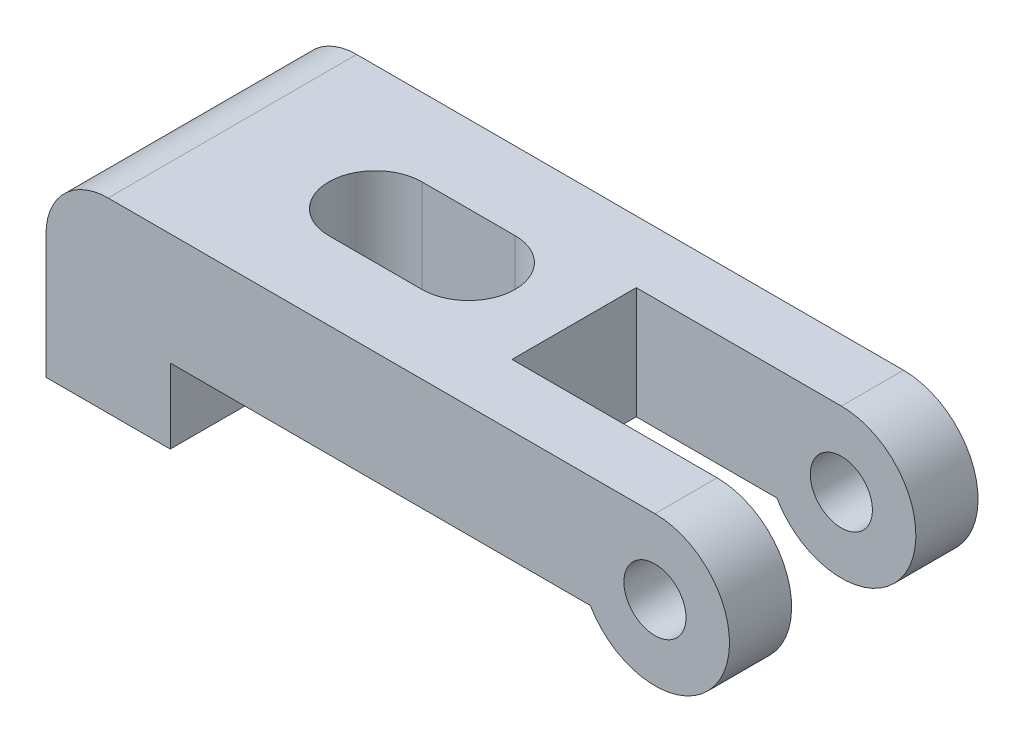
ISO-10303-21;
HEADER;
FILE_DESCRIPTION(('STEP AP214'),'2;1');
FILE_NAME('part.step','',(''),(''),'','','');
FILE_SCHEMA(('AUTOMOTIVE_DESIGN { 1 0 10303 214 1 1 1 1 }'));
ENDSEC;
DATA;
#1=APPLICATION_CONTEXT('core data for automotive mechanical design processes');
#2=APPLICATION_PROTOCOL_DEFINITION('international standard','automotive_design',2000,#1);
#3=PRODUCT_CONTEXT('',#1,'mechanical');
#4=PRODUCT('Part','Part','',(#3));
#5=PRODUCT_RELATED_PRODUCT_CATEGORY('part','',(#4));
#6=PRODUCT_DEFINITION_FORMATION('','',#4);
#7=PRODUCT_DEFINITION_CONTEXT('part definition',#1,'design');
#8=PRODUCT_DEFINITION('design','',#6,#7);
#9=PRODUCT_DEFINITION_SHAPE('','',#8);
#10=(LENGTH_UNIT() NAMED_UNIT(*) SI_UNIT(.MILLI.,.METRE.));
#11=(NAMED_UNIT(*) PLANE_ANGLE_UNIT() SI_UNIT($,.RADIAN.));
#12=(NAMED_UNIT(*) SI_UNIT($,.STERADIAN.) SOLID_ANGLE_UNIT());
#13=UNCERTAINTY_MEASURE_WITH_UNIT(LENGTH_MEASURE(1.E-05),#10,'distance_accuracy_value','');
#14=(GEOMETRIC_REPRESENTATION_CONTEXT(3) GLOBAL_UNCERTAINTY_ASSIGNED_CONTEXT((#13)) GLOBAL_UNIT_ASSIGNED_CONTEXT((#10,
#11,#12)) REPRESENTATION_CONTEXT('',''));
#15=CARTESIAN_POINT('',(0.,0.,0.));
#16=DIRECTION('',(0.,0.,1.));
#17=DIRECTION('',(1.,0.,0.));
#18=AXIS2_PLACEMENT_3D('',#15,#16,#17);
#19=CARTESIAN_POINT('',(980.,180.,400.));
#20=DIRECTION('',(0.,0.,-1.));
#21=DIRECTION('',(-1.,0.,0.));
#22=AXIS2_PLACEMENT_3D('',#19,#20,#21);
#23=CYLINDRICAL_SURFACE('',#22,120.);
#24=DIRECTION('',(0.,0.,-1.));
#25=VECTOR('',#24,1.);
#26=CARTESIAN_POINT('',(980.,300.,400.));
#27=LINE('',#26,#25);
#28=CARTESIAN_POINT('',(980.,300.,100.));
#29=VERTEX_POINT('',#28);
#30=CARTESIAN_POINT('',(980.,300.,0.));
#31=VERTEX_POINT('',#30);
#32=EDGE_CURVE('E301',#29,#31,#27,.T.);
#33=ORIENTED_EDGE('',*,*,#32,.F.);
#34=CARTESIAN_POINT('',(980.,180.,100.));
#35=DIRECTION('',(0.,0.,-1.));
#36=DIRECTION('',(-1.,0.,0.));
#37=AXIS2_PLACEMENT_3D('',#34,#35,#36);
#38=CIRCLE('',#37,120.);
#39=CARTESIAN_POINT('',(876.076951545867,120.,100.));
#40=VERTEX_POINT('',#39);
#41=EDGE_CURVE('E210',#29,#40,#38,.T.);
#42=ORIENTED_EDGE('',*,*,#41,.T.);
#43=DIRECTION('',(0.,0.,-1.));
#44=VECTOR('',#43,1.);
#45=CARTESIAN_POINT('',(876.076951545867,120.,400.));
#46=LINE('',#45,#44);
#47=CARTESIAN_POINT('',(876.076951545867,120.,0.));
#48=VERTEX_POINT('',#47);
#49=EDGE_CURVE('E306',#40,#48,#46,.T.);
#50=ORIENTED_EDGE('',*,*,#49,.T.);
#51=CARTESIAN_POINT('',(980.,180.,0.));
#52=DIRECTION('',(0.,0.,1.));
#53=DIRECTION('',(1.,0.,0.));
#54=AXIS2_PLACEMENT_3D('',#51,#52,#53);
#55=CIRCLE('',#54,120.);
#56=EDGE_CURVE('E278',#48,#31,#55,.T.);
#57=ORIENTED_EDGE('',*,*,#56,.T.);
#58=EDGE_LOOP('',(#33,#42,#50,#57));
#59=FACE_BOUND('',#58,.T.);
#60=ADVANCED_FACE('F39',(#59),#23,.T.);
#61=CARTESIAN_POINT('',(980.,180.,400.));
#62=DIRECTION('',(0.,0.,-1.));
#63=DIRECTION('',(-1.,0.,0.));
#64=AXIS2_PLACEMENT_3D('',#61,#62,#63);
#65=CYLINDRICAL_SURFACE('',#64,49.9999999999999);
#66=CARTESIAN_POINT('',(980.,180.,100.));
#67=DIRECTION('',(0.,0.,-1.));
#68=DIRECTION('',(-1.,0.,0.));
#69=AXIS2_PLACEMENT_3D('',#66,#67,#68);
#70=CIRCLE('',#69,49.9999999999999);
#71=CARTESIAN_POINT('',(930.,180.,100.));
#72=VERTEX_POINT('',#71);
#73=EDGE_CURVE('E43',#72,#72,#70,.T.);
#74=ORIENTED_EDGE('',*,*,#73,.F.);
#75=EDGE_LOOP('',(#74));
#76=FACE_BOUND('',#75,.T.);
#77=CARTESIAN_POINT('',(980.,180.,0.));
#78=DIRECTION('',(0.,0.,1.));
#79=DIRECTION('',(1.,0.,0.));
#80=AXIS2_PLACEMENT_3D('',#77,#78,#79);
#81=CIRCLE('',#80,49.9999999999999);
#82=CARTESIAN_POINT('',(1030.,180.,0.));
#83=VERTEX_POINT('',#82);
#84=EDGE_CURVE('E235',#83,#83,#81,.T.);
#85=ORIENTED_EDGE('',*,*,#84,.F.);
#86=EDGE_LOOP('',(#85));
#87=FACE_BOUND('',#86,.T.);
#88=ADVANCED_FACE('F326',(#76,#87),#65,.F.);
#89=CARTESIAN_POINT('',(980.,180.,400.));
#90=DIRECTION('',(0.,0.,1.));
#91=DIRECTION('',(1.,0.,0.));
#92=AXIS2_PLACEMENT_3D('',#89,#90,#91);
#93=PLANE('',#92);
#94=DIRECTION('',(1.,0.,0.));
#95=VECTOR('',#94,1.);
#96=CARTESIAN_POINT('',(0.,0.,400.));
#97=LINE('',#96,#95);
#98=CARTESIAN_POINT('',(0.,0.,400.));
#99=VERTEX_POINT('',#98);
#100=CARTESIAN_POINT('',(200.,0.,400.));
#101=VERTEX_POINT('',#100);
#102=EDGE_CURVE('E244',#99,#101,#97,.T.);
#103=ORIENTED_EDGE('',*,*,#102,.T.);
#104=DIRECTION('',(0.,1.,0.));
#105=VECTOR('',#104,1.);
#106=CARTESIAN_POINT('',(200.,0.,400.));
#107=LINE('',#106,#105);
#108=CARTESIAN_POINT('',(200.,120.,400.));
#109=VERTEX_POINT('',#108);
#110=EDGE_CURVE('E248',#101,#109,#107,.T.);
#111=ORIENTED_EDGE('',*,*,#110,.T.);
#112=DIRECTION('',(1.,0.,0.));
#113=VECTOR('',#112,1.);
#114=CARTESIAN_POINT('',(200.,120.,400.));
#115=LINE('',#114,#113);
#116=CARTESIAN_POINT('',(876.076951545867,120.,400.));
#117=VERTEX_POINT('',#116);
#118=EDGE_CURVE('E252',#109,#117,#115,.T.);
#119=ORIENTED_EDGE('',*,*,#118,.T.);
#120=CARTESIAN_POINT('',(980.,180.,400.));
#121=DIRECTION('',(0.,0.,1.));
#122=DIRECTION('',(1.,0.,0.));
#123=AXIS2_PLACEMENT_3D('',#120,#121,#122);
#124=CIRCLE('',#123,120.);
#125=CARTESIAN_POINT('',(980.,300.,400.));
#126=VERTEX_POINT('',#125);
#127=EDGE_CURVE('E255',#117,#126,#124,.T.);
#128=ORIENTED_EDGE('',*,*,#127,.T.);
#129=DIRECTION('',(-1.,0.,0.));
#130=VECTOR('',#129,1.);
#131=CARTESIAN_POINT('',(100.000000000001,300.,400.));
#132=LINE('',#131,#130);
#133=CARTESIAN_POINT('',(100.000000000001,300.,400.));
#134=VERTEX_POINT('',#133);
#135=EDGE_CURVE('E258',#126,#134,#132,.T.);
#136=ORIENTED_EDGE('',*,*,#135,.T.);
#137=CARTESIAN_POINT('',(100.,200.,400.));
#138=DIRECTION('',(0.,0.,1.));
#139=DIRECTION('',(1.,0.,0.));
#140=AXIS2_PLACEMENT_3D('',#137,#138,#139);
#141=CIRCLE('',#140,100.);
#142=CARTESIAN_POINT('',(0.,199.999999999999,400.));
#143=VERTEX_POINT('',#142);
#144=EDGE_CURVE('E261',#134,#143,#141,.T.);
#145=ORIENTED_EDGE('',*,*,#144,.T.);
#146=DIRECTION('',(0.,-1.,0.));
#147=VECTOR('',#146,1.);
#148=CARTESIAN_POINT('',(0.,0.,400.));
#149=LINE('',#148,#147);
#150=EDGE_CURVE('E264',#143,#99,#149,.T.);
#151=ORIENTED_EDGE('',*,*,#150,.T.);
#152=EDGE_LOOP('',(#103,#111,#119,#128,#136,#145,#151));
#153=FACE_BOUND('',#152,.T.);
#154=CARTESIAN_POINT('',(980.,180.,400.));
#155=DIRECTION('',(0.,0.,1.));
#156=DIRECTION('',(1.,0.,0.));
#157=AXIS2_PLACEMENT_3D('',#154,#155,#156);
#158=CIRCLE('',#157,49.9999999999999);
#159=CARTESIAN_POINT('',(1030.,180.,400.));
#160=VERTEX_POINT('',#159);
#161=EDGE_CURVE('E236',#160,#160,#158,.T.);
#162=ORIENTED_EDGE('',*,*,#161,.F.);
#163=EDGE_LOOP('',(#162));
#164=FACE_BOUND('',#163,.T.);
#165=ADVANCED_FACE('F329',(#153,#164),#93,.T.);
#166=CARTESIAN_POINT('',(980.,180.,0.));
#167=DIRECTION('',(0.,0.,1.));
#168=DIRECTION('',(1.,0.,0.));
#169=AXIS2_PLACEMENT_3D('',#166,#167,#168);
#170=PLANE('',#169);
#171=DIRECTION('',(1.,0.,0.));
#172=VECTOR('',#171,1.);
#173=CARTESIAN_POINT('',(0.,0.,0.));
#174=LINE('',#173,#172);
#175=CARTESIAN_POINT('',(0.,0.,0.));
#176=VERTEX_POINT('',#175);
#177=CARTESIAN_POINT('',(200.,0.,0.));
#178=VERTEX_POINT('',#177);
#179=EDGE_CURVE('E240',#176,#178,#174,.T.);
#180=ORIENTED_EDGE('',*,*,#179,.F.);
#181=DIRECTION('',(0.,-1.,0.));
#182=VECTOR('',#181,1.);
#183=CARTESIAN_POINT('',(0.,0.,0.));
#184=LINE('',#183,#182);
#185=CARTESIAN_POINT('',(0.,199.999999999999,0.));
#186=VERTEX_POINT('',#185);
#187=EDGE_CURVE('E249',#186,#176,#184,.T.);
#188=ORIENTED_EDGE('',*,*,#187,.F.);
#189=CARTESIAN_POINT('',(100.,200.,0.));
#190=DIRECTION('',(0.,0.,1.));
#191=DIRECTION('',(1.,0.,0.));
#192=AXIS2_PLACEMENT_3D('',#189,#190,#191);
#193=CIRCLE('',#192,100.);
#194=CARTESIAN_POINT('',(100.000000000001,300.,0.));
#195=VERTEX_POINT('',#194);
#196=EDGE_CURVE('E285',#195,#186,#193,.T.);
#197=ORIENTED_EDGE('',*,*,#196,.F.);
#198=DIRECTION('',(-1.,0.,0.));
#199=VECTOR('',#198,1.);
#200=CARTESIAN_POINT('',(100.000000000001,300.,0.));
#201=LINE('',#200,#199);
#202=EDGE_CURVE('E282',#31,#195,#201,.T.);
#203=ORIENTED_EDGE('',*,*,#202,.F.);
#204=ORIENTED_EDGE('',*,*,#56,.F.);
#205=DIRECTION('',(1.,0.,0.));
#206=VECTOR('',#205,1.);
#207=CARTESIAN_POINT('',(200.,120.,0.));
#208=LINE('',#207,#206);
#209=CARTESIAN_POINT('',(200.,120.,0.));
#210=VERTEX_POINT('',#209);
#211=EDGE_CURVE('E274',#210,#48,#208,.T.);
#212=ORIENTED_EDGE('',*,*,#211,.F.);
#213=DIRECTION('',(0.,1.,0.));
#214=VECTOR('',#213,1.);
#215=CARTESIAN_POINT('',(200.,0.,0.));
#216=LINE('',#215,#214);
#217=EDGE_CURVE('E271',#178,#210,#216,.T.);
#218=ORIENTED_EDGE('',*,*,#217,.F.);
#219=EDGE_LOOP('',(#180,#188,#197,#203,#204,#212,#218));
#220=FACE_BOUND('',#219,.T.);
#221=ORIENTED_EDGE('',*,*,#84,.T.);
#222=EDGE_LOOP('',(#221));
#223=FACE_BOUND('',#222,.T.);
#224=ADVANCED_FACE('F331',(#220,#223),#170,.F.);
#225=CARTESIAN_POINT('',(0.,0.,400.));
#226=DIRECTION('',(0.,1.,0.));
#227=DIRECTION('',(0.,0.,1.));
#228=AXIS2_PLACEMENT_3D('',#225,#226,#227);
#229=PLANE('',#228);
#230=ORIENTED_EDGE('',*,*,#179,.T.);
#231=DIRECTION('',(0.,0.,-1.));
#232=VECTOR('',#231,1.);
#233=CARTESIAN_POINT('',(200.,0.,400.));
#234=LINE('',#233,#232);
#235=EDGE_CURVE('E11',#101,#178,#234,.T.);
#236=ORIENTED_EDGE('',*,*,#235,.F.);
#237=ORIENTED_EDGE('',*,*,#102,.F.);
#238=DIRECTION('',(0.,0.,-1.));
#239=VECTOR('',#238,1.);
#240=CARTESIAN_POINT('',(0.,0.,400.));
#241=LINE('',#240,#239);
#242=EDGE_CURVE('E267',#99,#176,#241,.T.);
#243=ORIENTED_EDGE('',*,*,#242,.T.);
#244=EDGE_LOOP('',(#230,#236,#237,#243));
#245=FACE_BOUND('',#244,.T.);
#246=ADVANCED_FACE('F41',(#245),#229,.F.);
#247=CARTESIAN_POINT('',(200.,0.,400.));
#248=DIRECTION('',(-1.,0.,0.));
#249=DIRECTION('',(0.,0.,1.));
#250=AXIS2_PLACEMENT_3D('',#247,#248,#249);
#251=PLANE('',#250);
#252=ORIENTED_EDGE('',*,*,#217,.T.);
#253=DIRECTION('',(0.,0.,-1.));
#254=VECTOR('',#253,1.);
#255=CARTESIAN_POINT('',(200.,120.,400.));
#256=LINE('',#255,#254);
#257=EDGE_CURVE('E49',#109,#210,#256,.T.);
#258=ORIENTED_EDGE('',*,*,#257,.F.);
#259=ORIENTED_EDGE('',*,*,#110,.F.);
#260=ORIENTED_EDGE('',*,*,#235,.T.);
#261=EDGE_LOOP('',(#252,#258,#259,#260));
#262=FACE_BOUND('',#261,.T.);
#263=ADVANCED_FACE('F358',(#262),#251,.F.);
#264=CARTESIAN_POINT('',(200.,120.,400.));
#265=DIRECTION('',(0.,1.,0.));
#266=DIRECTION('',(0.,0.,1.));
#267=AXIS2_PLACEMENT_3D('',#264,#265,#266);
#268=PLANE('',#267);
#269=DIRECTION('',(-1.,0.,0.));
#270=VECTOR('',#269,1.);
#271=CARTESIAN_POINT('',(200.,120.,125.));
#272=LINE('',#271,#270);
#273=CARTESIAN_POINT('',(480.,120.,125.));
#274=VERTEX_POINT('',#273);
#275=CARTESIAN_POINT('',(330.,120.,125.));
#276=VERTEX_POINT('',#275);
#277=EDGE_CURVE('E227',#274,#276,#272,.T.);
#278=ORIENTED_EDGE('',*,*,#277,.T.);
#279=CARTESIAN_POINT('',(330.,120.,200.));
#280=DIRECTION('',(0.,1.,0.));
#281=DIRECTION('',(0.,0.,1.));
#282=AXIS2_PLACEMENT_3D('',#279,#280,#281);
#283=CIRCLE('',#282,75.);
#284=CARTESIAN_POINT('',(330.,120.,275.));
#285=VERTEX_POINT('',#284);
#286=EDGE_CURVE('E231',#276,#285,#283,.T.);
#287=ORIENTED_EDGE('',*,*,#286,.T.);
#288=DIRECTION('',(1.,0.,0.));
#289=VECTOR('',#288,1.);
#290=CARTESIAN_POINT('',(200.,120.,275.));
#291=LINE('',#290,#289);
#292=CARTESIAN_POINT('',(480.,120.,275.));
#293=VERTEX_POINT('',#292);
#294=EDGE_CURVE('E222',#285,#293,#291,.T.);
#295=ORIENTED_EDGE('',*,*,#294,.T.);
#296=CARTESIAN_POINT('',(480.,120.,200.));
#297=DIRECTION('',(0.,1.,0.));
#298=DIRECTION('',(0.,0.,1.));
#299=AXIS2_PLACEMENT_3D('',#296,#297,#298);
#300=CIRCLE('',#299,75.);
#301=EDGE_CURVE('E155',#293,#274,#300,.T.);
#302=ORIENTED_EDGE('',*,*,#301,.T.);
#303=EDGE_LOOP('',(#278,#287,#295,#302));
#304=FACE_BOUND('',#303,.T.);
#305=ORIENTED_EDGE('',*,*,#49,.F.);
#306=DIRECTION('',(-1.,0.,0.));
#307=VECTOR('',#306,1.);
#308=CARTESIAN_POINT('',(200.,120.,100.));
#309=LINE('',#308,#307);
#310=CARTESIAN_POINT('',(650.,120.,100.));
#311=VERTEX_POINT('',#310);
#312=EDGE_CURVE('E214',#40,#311,#309,.T.);
#313=ORIENTED_EDGE('',*,*,#312,.T.);
#314=DIRECTION('',(0.,0.,1.));
#315=VECTOR('',#314,1.);
#316=CARTESIAN_POINT('',(650.,120.,400.));
#317=LINE('',#316,#315);
#318=CARTESIAN_POINT('',(650.,120.,300.));
#319=VERTEX_POINT('',#318);
#320=EDGE_CURVE('E218',#311,#319,#317,.T.);
#321=ORIENTED_EDGE('',*,*,#320,.T.);
#322=DIRECTION('',(1.,0.,0.));
#323=VECTOR('',#322,1.);
#324=CARTESIAN_POINT('',(200.,120.,300.));
#325=LINE('',#324,#323);
#326=CARTESIAN_POINT('',(876.076951545867,120.,300.));
#327=VERTEX_POINT('',#326);
#328=EDGE_CURVE('E206',#319,#327,#325,.T.);
#329=ORIENTED_EDGE('',*,*,#328,.T.);
#330=EDGE_CURVE('E307',#117,#327,#46,.T.);
#331=ORIENTED_EDGE('',*,*,#330,.F.);
#332=ORIENTED_EDGE('',*,*,#118,.F.);
#333=ORIENTED_EDGE('',*,*,#257,.T.);
#334=ORIENTED_EDGE('',*,*,#211,.T.);
#335=EDGE_LOOP('',(#305,#313,#321,#329,#331,#332,#333,#334));
#336=FACE_BOUND('',#335,.T.);
#337=ADVANCED_FACE('F351',(#304,#336),#268,.F.);
#338=ORIENTED_EDGE('',*,*,#330,.T.);
#339=CARTESIAN_POINT('',(980.,180.,300.));
#340=DIRECTION('',(0.,0.,1.));
#341=DIRECTION('',(1.,0.,0.));
#342=AXIS2_PLACEMENT_3D('',#339,#340,#341);
#343=CIRCLE('',#342,120.);
#344=CARTESIAN_POINT('',(980.,300.,300.));
#345=VERTEX_POINT('',#344);
#346=EDGE_CURVE('E202',#327,#345,#343,.T.);
#347=ORIENTED_EDGE('',*,*,#346,.T.);
#348=EDGE_CURVE('E302',#126,#345,#27,.T.);
#349=ORIENTED_EDGE('',*,*,#348,.F.);
#350=ORIENTED_EDGE('',*,*,#127,.F.);
#351=EDGE_LOOP('',(#338,#347,#349,#350));
#352=FACE_BOUND('',#351,.T.);
#353=ADVANCED_FACE('F344',(#352),#23,.T.);
#354=CARTESIAN_POINT('',(100.000000000001,300.,400.));
#355=DIRECTION('',(0.,-1.,0.));
#356=DIRECTION('',(1.,0.,0.));
#357=AXIS2_PLACEMENT_3D('',#354,#355,#356);
#358=PLANE('',#357);
#359=DIRECTION('',(1.,0.,0.));
#360=VECTOR('',#359,1.);
#361=CARTESIAN_POINT('',(330.,300.,275.));
#362=LINE('',#361,#360);
#363=CARTESIAN_POINT('',(330.,300.,275.));
#364=VERTEX_POINT('',#363);
#365=CARTESIAN_POINT('',(480.,300.,275.));
#366=VERTEX_POINT('',#365);
#367=EDGE_CURVE('E162',#364,#366,#362,.T.);
#368=ORIENTED_EDGE('',*,*,#367,.F.);
#369=CARTESIAN_POINT('',(330.,300.,200.));
#370=DIRECTION('',(0.,1.,0.));
#371=DIRECTION('',(-1.,0.,0.));
#372=AXIS2_PLACEMENT_3D('',#369,#370,#371);
#373=CIRCLE('',#372,75.);
#374=CARTESIAN_POINT('',(330.,300.,125.));
#375=VERTEX_POINT('',#374);
#376=EDGE_CURVE('E65',#375,#364,#373,.T.);
#377=ORIENTED_EDGE('',*,*,#376,.F.);
#378=DIRECTION('',(-1.,0.,0.));
#379=VECTOR('',#378,1.);
#380=CARTESIAN_POINT('',(330.,300.,125.));
#381=LINE('',#380,#379);
#382=CARTESIAN_POINT('',(480.,300.,125.));
#383=VERTEX_POINT('',#382);
#384=EDGE_CURVE('E170',#383,#375,#381,.T.);
#385=ORIENTED_EDGE('',*,*,#384,.F.);
#386=CARTESIAN_POINT('',(480.,300.,200.));
#387=DIRECTION('',(0.,1.,0.));
#388=DIRECTION('',(-1.,0.,0.));
#389=AXIS2_PLACEMENT_3D('',#386,#387,#388);
#390=CIRCLE('',#389,75.);
#391=EDGE_CURVE('E152',#366,#383,#390,.T.);
#392=ORIENTED_EDGE('',*,*,#391,.F.);
#393=EDGE_LOOP('',(#368,#377,#385,#392));
#394=FACE_BOUND('',#393,.T.);
#395=DIRECTION('',(0.,0.,1.));
#396=VECTOR('',#395,1.);
#397=CARTESIAN_POINT('',(650.,300.,300.));
#398=LINE('',#397,#396);
#399=CARTESIAN_POINT('',(650.,300.,100.));
#400=VERTEX_POINT('',#399);
#401=CARTESIAN_POINT('',(650.,300.,300.));
#402=VERTEX_POINT('',#401);
#403=EDGE_CURVE('E185',#400,#402,#398,.T.);
#404=ORIENTED_EDGE('',*,*,#403,.F.);
#405=DIRECTION('',(-1.,0.,0.));
#406=VECTOR('',#405,1.);
#407=CARTESIAN_POINT('',(650.,300.,100.));
#408=LINE('',#407,#406);
#409=EDGE_CURVE('E191',#29,#400,#408,.T.);
#410=ORIENTED_EDGE('',*,*,#409,.F.);
#411=ORIENTED_EDGE('',*,*,#32,.T.);
#412=ORIENTED_EDGE('',*,*,#202,.T.);
#413=DIRECTION('',(0.,0.,-1.));
#414=VECTOR('',#413,1.);
#415=CARTESIAN_POINT('',(100.000000000001,300.,400.));
#416=LINE('',#415,#414);
#417=EDGE_CURVE('E297',#134,#195,#416,.T.);
#418=ORIENTED_EDGE('',*,*,#417,.F.);
#419=ORIENTED_EDGE('',*,*,#135,.F.);
#420=ORIENTED_EDGE('',*,*,#348,.T.);
#421=DIRECTION('',(1.,0.,0.));
#422=VECTOR('',#421,1.);
#423=CARTESIAN_POINT('',(650.,300.,300.));
#424=LINE('',#423,#422);
#425=EDGE_CURVE('E188',#402,#345,#424,.T.);
#426=ORIENTED_EDGE('',*,*,#425,.F.);
#427=EDGE_LOOP('',(#404,#410,#411,#412,#418,#419,#420,#426));
#428=FACE_BOUND('',#427,.T.);
#429=ADVANCED_FACE('F167',(#394,#428),#358,.F.);
#430=CARTESIAN_POINT('',(100.,200.,400.));
#431=DIRECTION('',(0.,0.,-1.));
#432=DIRECTION('',(-1.,0.,0.));
#433=AXIS2_PLACEMENT_3D('',#430,#431,#432);
#434=CYLINDRICAL_SURFACE('',#433,100.);
#435=ORIENTED_EDGE('',*,*,#196,.T.);
#436=DIRECTION('',(0.,0.,-1.));
#437=VECTOR('',#436,1.);
#438=CARTESIAN_POINT('',(0.,199.999999999999,400.));
#439=LINE('',#438,#437);
#440=EDGE_CURVE('E293',#143,#186,#439,.T.);
#441=ORIENTED_EDGE('',*,*,#440,.F.);
#442=ORIENTED_EDGE('',*,*,#144,.F.);
#443=ORIENTED_EDGE('',*,*,#417,.T.);
#444=EDGE_LOOP('',(#435,#441,#442,#443));
#445=FACE_BOUND('',#444,.T.);
#446=ADVANCED_FACE('F357',(#445),#434,.T.);
#447=CARTESIAN_POINT('',(0.,0.,400.));
#448=DIRECTION('',(1.,0.,0.));
#449=DIRECTION('',(0.,0.,-1.));
#450=AXIS2_PLACEMENT_3D('',#447,#448,#449);
#451=PLANE('',#450);
#452=ORIENTED_EDGE('',*,*,#187,.T.);
#453=ORIENTED_EDGE('',*,*,#242,.F.);
#454=ORIENTED_EDGE('',*,*,#150,.F.);
#455=ORIENTED_EDGE('',*,*,#440,.T.);
#456=EDGE_LOOP('',(#452,#453,#454,#455));
#457=FACE_BOUND('',#456,.T.);
#458=ADVANCED_FACE('F324',(#457),#451,.F.);
#459=CARTESIAN_POINT('',(980.,180.,300.));
#460=DIRECTION('',(0.,0.,1.));
#461=DIRECTION('',(1.,0.,0.));
#462=AXIS2_PLACEMENT_3D('',#459,#460,#461);
#463=CIRCLE('',#462,49.9999999999999);
#464=CARTESIAN_POINT('',(1030.,180.,300.));
#465=VERTEX_POINT('',#464);
#466=EDGE_CURVE('E180',#465,#465,#463,.T.);
#467=ORIENTED_EDGE('',*,*,#466,.F.);
#468=EDGE_LOOP('',(#467));
#469=FACE_BOUND('',#468,.T.);
#470=ORIENTED_EDGE('',*,*,#161,.T.);
#471=EDGE_LOOP('',(#470));
#472=FACE_BOUND('',#471,.T.);
#473=ADVANCED_FACE('F320',(#469,#472),#65,.F.);
#474=CARTESIAN_POINT('',(650.,0.,300.));
#475=DIRECTION('',(-1.,0.,0.));
#476=DIRECTION('',(0.,-1.,0.));
#477=AXIS2_PLACEMENT_3D('',#474,#475,#476);
#478=PLANE('',#477);
#479=DIRECTION('',(0.,1.,0.));
#480=VECTOR('',#479,1.);
#481=CARTESIAN_POINT('',(650.,0.,100.));
#482=LINE('',#481,#480);
#483=EDGE_CURVE('E196',#311,#400,#482,.T.);
#484=ORIENTED_EDGE('',*,*,#483,.T.);
#485=ORIENTED_EDGE('',*,*,#403,.T.);
#486=DIRECTION('',(0.,1.,0.));
#487=VECTOR('',#486,1.);
#488=CARTESIAN_POINT('',(650.,0.,300.));
#489=LINE('',#488,#487);
#490=EDGE_CURVE('E195',#319,#402,#489,.T.);
#491=ORIENTED_EDGE('',*,*,#490,.F.);
#492=ORIENTED_EDGE('',*,*,#320,.F.);
#493=EDGE_LOOP('',(#484,#485,#491,#492));
#494=FACE_BOUND('',#493,.T.);
#495=ADVANCED_FACE('F323',(#494),#478,.F.);
#496=CARTESIAN_POINT('',(650.,0.,100.));
#497=DIRECTION('',(0.,0.,-1.));
#498=DIRECTION('',(-1.,0.,0.));
#499=AXIS2_PLACEMENT_3D('',#496,#497,#498);
#500=PLANE('',#499);
#501=ORIENTED_EDGE('',*,*,#73,.T.);
#502=EDGE_LOOP('',(#501));
#503=FACE_BOUND('',#502,.T.);
#504=ORIENTED_EDGE('',*,*,#41,.F.);
#505=ORIENTED_EDGE('',*,*,#409,.T.);
#506=ORIENTED_EDGE('',*,*,#483,.F.);
#507=ORIENTED_EDGE('',*,*,#312,.F.);
#508=EDGE_LOOP('',(#504,#505,#506,#507));
#509=FACE_BOUND('',#508,.T.);
#510=ADVANCED_FACE('F392',(#503,#509),#500,.F.);
#511=CARTESIAN_POINT('',(650.,0.,300.));
#512=DIRECTION('',(0.,0.,1.));
#513=DIRECTION('',(1.,0.,0.));
#514=AXIS2_PLACEMENT_3D('',#511,#512,#513);
#515=PLANE('',#514);
#516=ORIENTED_EDGE('',*,*,#466,.T.);
#517=EDGE_LOOP('',(#516));
#518=FACE_BOUND('',#517,.T.);
#519=ORIENTED_EDGE('',*,*,#490,.T.);
#520=ORIENTED_EDGE('',*,*,#425,.T.);
#521=ORIENTED_EDGE('',*,*,#346,.F.);
#522=ORIENTED_EDGE('',*,*,#328,.F.);
#523=EDGE_LOOP('',(#519,#520,#521,#522));
#524=FACE_BOUND('',#523,.T.);
#525=ADVANCED_FACE('F317',(#518,#524),#515,.F.);
#526=CARTESIAN_POINT('',(330.,0.,200.));
#527=DIRECTION('',(0.,1.,0.));
#528=DIRECTION('',(-1.,0.,0.));
#529=AXIS2_PLACEMENT_3D('',#526,#527,#528);
#530=CYLINDRICAL_SURFACE('',#529,75.);
#531=DIRECTION('',(0.,1.,0.));
#532=VECTOR('',#531,1.);
#533=CARTESIAN_POINT('',(330.,0.,125.));
#534=LINE('',#533,#532);
#535=EDGE_CURVE('E177',#276,#375,#534,.T.);
#536=ORIENTED_EDGE('',*,*,#535,.T.);
#537=ORIENTED_EDGE('',*,*,#376,.T.);
#538=DIRECTION('',(0.,1.,0.));
#539=VECTOR('',#538,1.);
#540=CARTESIAN_POINT('',(330.,0.,275.));
#541=LINE('',#540,#539);
#542=EDGE_CURVE('E159',#285,#364,#541,.T.);
#543=ORIENTED_EDGE('',*,*,#542,.F.);
#544=ORIENTED_EDGE('',*,*,#286,.F.);
#545=EDGE_LOOP('',(#536,#537,#543,#544));
#546=FACE_BOUND('',#545,.T.);
#547=ADVANCED_FACE('F402',(#546),#530,.F.);
#548=CARTESIAN_POINT('',(330.,0.,125.));
#549=DIRECTION('',(0.,0.,-1.));
#550=DIRECTION('',(-1.,0.,0.));
#551=AXIS2_PLACEMENT_3D('',#548,#549,#550);
#552=PLANE('',#551);
#553=DIRECTION('',(0.,1.,0.));
#554=VECTOR('',#553,1.);
#555=CARTESIAN_POINT('',(480.,0.,125.));
#556=LINE('',#555,#554);
#557=EDGE_CURVE('E158',#274,#383,#556,.T.);
#558=ORIENTED_EDGE('',*,*,#557,.T.);
#559=ORIENTED_EDGE('',*,*,#384,.T.);
#560=ORIENTED_EDGE('',*,*,#535,.F.);
#561=ORIENTED_EDGE('',*,*,#277,.F.);
#562=EDGE_LOOP('',(#558,#559,#560,#561));
#563=FACE_BOUND('',#562,.T.);
#564=ADVANCED_FACE('F408',(#563),#552,.F.);
#565=CARTESIAN_POINT('',(480.,0.,200.));
#566=DIRECTION('',(0.,1.,0.));
#567=DIRECTION('',(-1.,0.,0.));
#568=AXIS2_PLACEMENT_3D('',#565,#566,#567);
#569=CYLINDRICAL_SURFACE('',#568,75.);
#570=DIRECTION('',(0.,1.,0.));
#571=VECTOR('',#570,1.);
#572=CARTESIAN_POINT('',(480.,0.,275.));
#573=LINE('',#572,#571);
#574=EDGE_CURVE('E57',#293,#366,#573,.T.);
#575=ORIENTED_EDGE('',*,*,#574,.T.);
#576=ORIENTED_EDGE('',*,*,#391,.T.);
#577=ORIENTED_EDGE('',*,*,#557,.F.);
#578=ORIENTED_EDGE('',*,*,#301,.F.);
#579=EDGE_LOOP('',(#575,#576,#577,#578));
#580=FACE_BOUND('',#579,.T.);
#581=ADVANCED_FACE('F149',(#580),#569,.F.);
#582=CARTESIAN_POINT('',(330.,0.,275.));
#583=DIRECTION('',(0.,0.,1.));
#584=DIRECTION('',(1.,0.,0.));
#585=AXIS2_PLACEMENT_3D('',#582,#583,#584);
#586=PLANE('',#585);
#587=ORIENTED_EDGE('',*,*,#542,.T.);
#588=ORIENTED_EDGE('',*,*,#367,.T.);
#589=ORIENTED_EDGE('',*,*,#574,.F.);
#590=ORIENTED_EDGE('',*,*,#294,.F.);
#591=EDGE_LOOP('',(#587,#588,#589,#590));
#592=FACE_BOUND('',#591,.T.);
#593=ADVANCED_FACE('F163',(#592),#586,.F.);
#594=CLOSED_SHELL('',(#60,#88,#165,#224,#246,#263,#337,#353,#429,#446,#458,#473,#495,#510,#525,
#547,#564,#581,#593));
#595=MANIFOLD_SOLID_BREP('B2',#594);
#596=ADVANCED_BREP_SHAPE_REPRESENTATION('',(#18,#595),#14);
#597=SHAPE_DEFINITION_REPRESENTATION(#9,#596);
ENDSEC;
END-ISO-10303-21;
